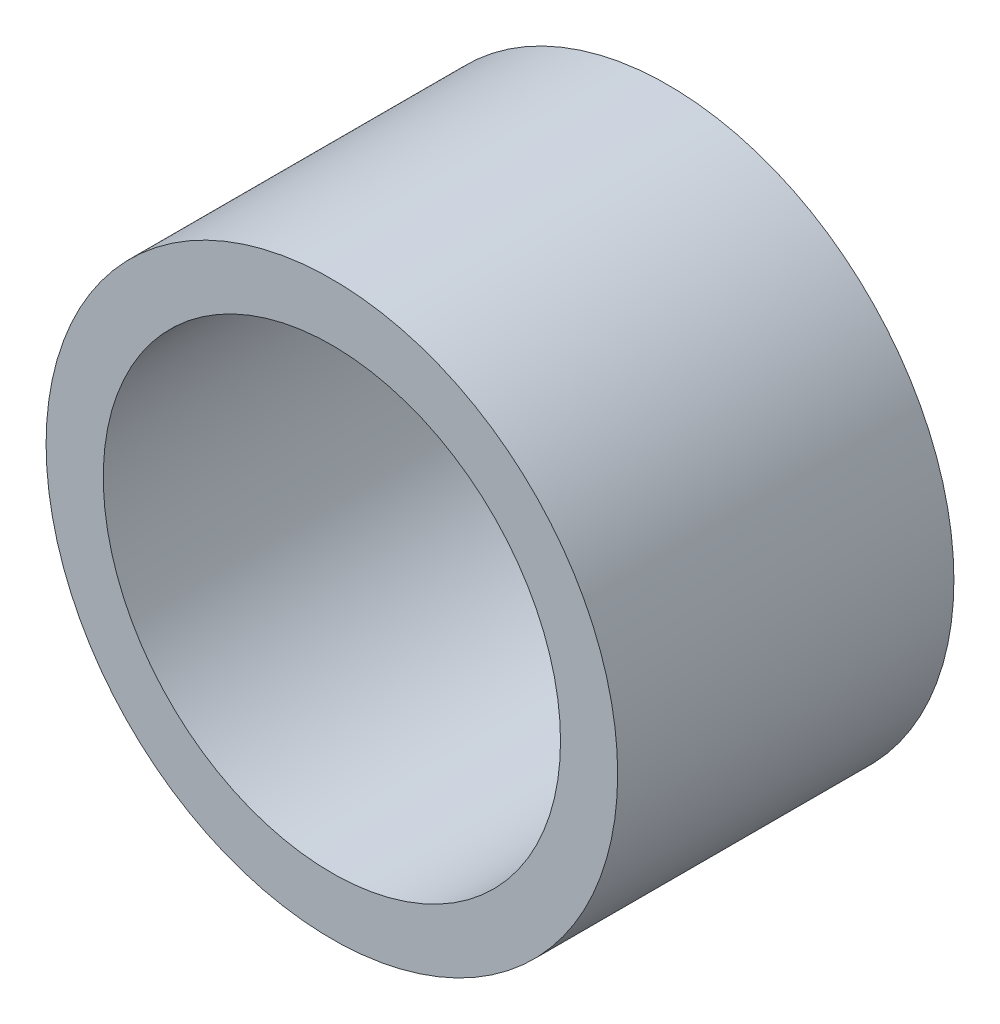
ISO-10303-21;
HEADER;
FILE_DESCRIPTION(('STEP AP214'),'2;1');
FILE_NAME('part.step','',(''),(''),'','','');
FILE_SCHEMA(('AUTOMOTIVE_DESIGN { 1 0 10303 214 1 1 1 1 }'));
ENDSEC;
DATA;
#1=APPLICATION_CONTEXT('core data for automotive mechanical design processes');
#2=APPLICATION_PROTOCOL_DEFINITION('international standard','automotive_design',2000,#1);
#3=PRODUCT_CONTEXT('',#1,'mechanical');
#4=PRODUCT('Part','Part','',(#3));
#5=PRODUCT_RELATED_PRODUCT_CATEGORY('part','',(#4));
#6=PRODUCT_DEFINITION_FORMATION('','',#4);
#7=PRODUCT_DEFINITION_CONTEXT('part definition',#1,'design');
#8=PRODUCT_DEFINITION('design','',#6,#7);
#9=PRODUCT_DEFINITION_SHAPE('','',#8);
#10=(LENGTH_UNIT() NAMED_UNIT(*) SI_UNIT(.MILLI.,.METRE.));
#11=(NAMED_UNIT(*) PLANE_ANGLE_UNIT() SI_UNIT($,.RADIAN.));
#12=(NAMED_UNIT(*) SI_UNIT($,.STERADIAN.) SOLID_ANGLE_UNIT());
#13=UNCERTAINTY_MEASURE_WITH_UNIT(LENGTH_MEASURE(1.E-05),#10,'distance_accuracy_value','');
#14=(GEOMETRIC_REPRESENTATION_CONTEXT(3) GLOBAL_UNCERTAINTY_ASSIGNED_CONTEXT((#13)) GLOBAL_UNIT_ASSIGNED_CONTEXT((#10,
#11,#12)) REPRESENTATION_CONTEXT('',''));
#15=CARTESIAN_POINT('',(0.,0.,0.));
#16=DIRECTION('',(0.,0.,1.));
#17=DIRECTION('',(1.,0.,0.));
#18=AXIS2_PLACEMENT_3D('',#15,#16,#17);
#19=CARTESIAN_POINT('',(0.,0.,5.));
#20=DIRECTION('',(0.,0.,1.));
#21=DIRECTION('',(1.,0.,0.));
#22=AXIS2_PLACEMENT_3D('',#19,#20,#21);
#23=PLANE('',#22);
#24=CARTESIAN_POINT('',(0.,0.,5.));
#25=DIRECTION('',(0.,0.,1.));
#26=DIRECTION('',(1.,0.,0.));
#27=AXIS2_PLACEMENT_3D('',#24,#25,#26);
#28=CIRCLE('',#27,4.25);
#29=CARTESIAN_POINT('',(4.25,0.,5.));
#30=VERTEX_POINT('',#29);
#31=EDGE_CURVE('E10',#30,#30,#28,.T.);
#32=ORIENTED_EDGE('',*,*,#31,.T.);
#33=EDGE_LOOP('',(#32));
#34=FACE_BOUND('',#33,.T.);
#35=CARTESIAN_POINT('',(0.,0.,5.));
#36=DIRECTION('',(0.,0.,1.));
#37=DIRECTION('',(1.,0.,0.));
#38=AXIS2_PLACEMENT_3D('',#35,#36,#37);
#39=CIRCLE('',#38,3.4);
#40=CARTESIAN_POINT('',(3.4,0.,5.));
#41=VERTEX_POINT('',#40);
#42=EDGE_CURVE('E46',#41,#41,#39,.T.);
#43=ORIENTED_EDGE('',*,*,#42,.F.);
#44=EDGE_LOOP('',(#43));
#45=FACE_BOUND('',#44,.T.);
#46=ADVANCED_FACE('F35',(#34,#45),#23,.T.);
#47=CARTESIAN_POINT('',(0.,0.,0.));
#48=DIRECTION('',(0.,0.,1.));
#49=DIRECTION('',(1.,0.,0.));
#50=AXIS2_PLACEMENT_3D('',#47,#48,#49);
#51=PLANE('',#50);
#52=CARTESIAN_POINT('',(0.,0.,0.));
#53=DIRECTION('',(0.,0.,1.));
#54=DIRECTION('',(1.,0.,0.));
#55=AXIS2_PLACEMENT_3D('',#52,#53,#54);
#56=CIRCLE('',#55,4.25);
#57=CARTESIAN_POINT('',(4.25,0.,0.));
#58=VERTEX_POINT('',#57);
#59=EDGE_CURVE('E39',#58,#58,#56,.T.);
#60=ORIENTED_EDGE('',*,*,#59,.F.);
#61=EDGE_LOOP('',(#60));
#62=FACE_BOUND('',#61,.T.);
#63=CARTESIAN_POINT('',(0.,0.,0.));
#64=DIRECTION('',(0.,0.,1.));
#65=DIRECTION('',(1.,0.,0.));
#66=AXIS2_PLACEMENT_3D('',#63,#64,#65);
#67=CIRCLE('',#66,3.4);
#68=CARTESIAN_POINT('',(3.4,0.,0.));
#69=VERTEX_POINT('',#68);
#70=EDGE_CURVE('E48',#69,#69,#67,.T.);
#71=ORIENTED_EDGE('',*,*,#70,.T.);
#72=EDGE_LOOP('',(#71));
#73=FACE_BOUND('',#72,.T.);
#74=ADVANCED_FACE('F58',(#62,#73),#51,.F.);
#75=CARTESIAN_POINT('',(0.,0.,5.));
#76=DIRECTION('',(0.,0.,-1.));
#77=DIRECTION('',(-1.,0.,0.));
#78=AXIS2_PLACEMENT_3D('',#75,#76,#77);
#79=CYLINDRICAL_SURFACE('',#78,4.25);
#80=ORIENTED_EDGE('',*,*,#31,.F.);
#81=EDGE_LOOP('',(#80));
#82=FACE_BOUND('',#81,.T.);
#83=ORIENTED_EDGE('',*,*,#59,.T.);
#84=EDGE_LOOP('',(#83));
#85=FACE_BOUND('',#84,.T.);
#86=ADVANCED_FACE('F37',(#82,#85),#79,.T.);
#87=CARTESIAN_POINT('',(0.,0.,5.));
#88=DIRECTION('',(0.,0.,-1.));
#89=DIRECTION('',(-1.,0.,0.));
#90=AXIS2_PLACEMENT_3D('',#87,#88,#89);
#91=CYLINDRICAL_SURFACE('',#90,3.4);
#92=ORIENTED_EDGE('',*,*,#42,.T.);
#93=EDGE_LOOP('',(#92));
#94=FACE_BOUND('',#93,.T.);
#95=ORIENTED_EDGE('',*,*,#70,.F.);
#96=EDGE_LOOP('',(#95));
#97=FACE_BOUND('',#96,.T.);
#98=ADVANCED_FACE('F54',(#94,#97),#91,.F.);
#99=CLOSED_SHELL('',(#46,#74,#86,#98));
#100=MANIFOLD_SOLID_BREP('B2',#99);
#101=ADVANCED_BREP_SHAPE_REPRESENTATION('',(#18,#100),#14);
#102=SHAPE_DEFINITION_REPRESENTATION(#9,#101);
ENDSEC;
END-ISO-10303-21;
